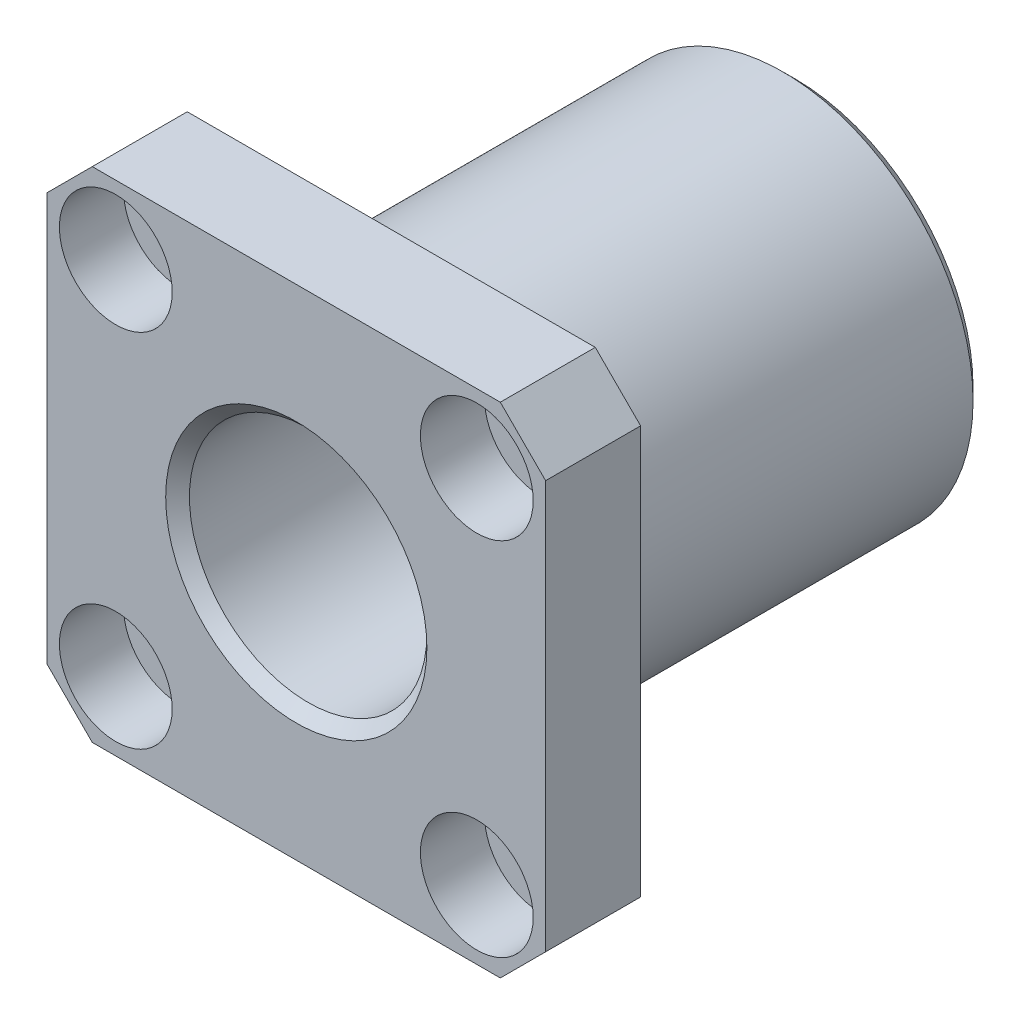
ISO-10303-21;
HEADER;
FILE_DESCRIPTION(('STEP AP214'),'2;1');
FILE_NAME('part.step','',(''),(''),'','','');
FILE_SCHEMA(('AUTOMOTIVE_DESIGN { 1 0 10303 214 1 1 1 1 }'));
ENDSEC;
DATA;
#1=APPLICATION_CONTEXT('core data for automotive mechanical design processes');
#2=APPLICATION_PROTOCOL_DEFINITION('international standard','automotive_design',2000,#1);
#3=PRODUCT_CONTEXT('',#1,'mechanical');
#4=PRODUCT('Part','Part','',(#3));
#5=PRODUCT_RELATED_PRODUCT_CATEGORY('part','',(#4));
#6=PRODUCT_DEFINITION_FORMATION('','',#4);
#7=PRODUCT_DEFINITION_CONTEXT('part definition',#1,'design');
#8=PRODUCT_DEFINITION('design','',#6,#7);
#9=PRODUCT_DEFINITION_SHAPE('','',#8);
#10=(LENGTH_UNIT() NAMED_UNIT(*) SI_UNIT(.MILLI.,.METRE.));
#11=(NAMED_UNIT(*) PLANE_ANGLE_UNIT() SI_UNIT($,.RADIAN.));
#12=(NAMED_UNIT(*) SI_UNIT($,.STERADIAN.) SOLID_ANGLE_UNIT());
#13=UNCERTAINTY_MEASURE_WITH_UNIT(LENGTH_MEASURE(1.E-05),#10,'distance_accuracy_value','');
#14=(GEOMETRIC_REPRESENTATION_CONTEXT(3) GLOBAL_UNCERTAINTY_ASSIGNED_CONTEXT((#13)) GLOBAL_UNIT_ASSIGNED_CONTEXT((#10,
#11,#12)) REPRESENTATION_CONTEXT('',''));
#15=CARTESIAN_POINT('',(0.,0.,0.));
#16=DIRECTION('',(0.,0.,1.));
#17=DIRECTION('',(1.,0.,0.));
#18=AXIS2_PLACEMENT_3D('',#15,#16,#17);
#19=CARTESIAN_POINT('',(0.,0.,42.));
#20=DIRECTION('',(0.,0.,-1.));
#21=DIRECTION('',(-1.,0.,0.));
#22=AXIS2_PLACEMENT_3D('',#19,#20,#21);
#23=CYLINDRICAL_SURFACE('',#22,16.);
#24=CARTESIAN_POINT('',(0.,0.,1.00000000000006));
#25=DIRECTION('',(0.,0.,1.));
#26=DIRECTION('',(1.,0.,0.));
#27=AXIS2_PLACEMENT_3D('',#24,#25,#26);
#28=CIRCLE('',#27,16.);
#29=CARTESIAN_POINT('',(-16.,0.,1.00000000000006));
#30=VERTEX_POINT('',#29);
#31=EDGE_CURVE('E141',#30,#30,#28,.T.);
#32=CARTESIAN_POINT('',(0.,0.,34.));
#33=DIRECTION('',(0.,0.,-1.));
#34=DIRECTION('',(-1.,0.,0.));
#35=AXIS2_PLACEMENT_3D('',#32,#33,#34);
#36=CIRCLE('',#35,16.);
#37=CARTESIAN_POINT('',(-16.,0.,34.));
#38=VERTEX_POINT('',#37);
#39=EDGE_CURVE('E138',#38,#38,#36,.T.);
#40=CARTESIAN_POINT('',(-16.,0.,1.00000000000006));
#41=CARTESIAN_POINT('',(-16.,0.,1.34375000000006));
#42=CARTESIAN_POINT('',(-16.,0.,1.68750000000005));
#43=CARTESIAN_POINT('',(-16.,0.,2.37500000000005));
#44=CARTESIAN_POINT('',(-16.,0.,2.71875000000005));
#45=CARTESIAN_POINT('',(-16.,0.,3.40625000000005));
#46=CARTESIAN_POINT('',(-16.,0.,3.75000000000005));
#47=CARTESIAN_POINT('',(-16.,0.,4.43750000000006));
#48=CARTESIAN_POINT('',(-16.,0.,4.78125000000005));
#49=CARTESIAN_POINT('',(-16.,0.,5.46875000000005));
#50=CARTESIAN_POINT('',(-16.,0.,5.81250000000005));
#51=CARTESIAN_POINT('',(-16.,0.,6.50000000000005));
#52=CARTESIAN_POINT('',(-16.,0.,6.84375000000005));
#53=CARTESIAN_POINT('',(-16.,0.,7.53125000000005));
#54=CARTESIAN_POINT('',(-16.,0.,7.87500000000005));
#55=CARTESIAN_POINT('',(-16.,0.,8.56250000000005));
#56=CARTESIAN_POINT('',(-16.,0.,8.90625000000005));
#57=CARTESIAN_POINT('',(-16.,0.,9.59375000000005));
#58=CARTESIAN_POINT('',(-16.,0.,9.93750000000005));
#59=CARTESIAN_POINT('',(-16.,0.,10.625));
#60=CARTESIAN_POINT('',(-16.,0.,10.96875));
#61=CARTESIAN_POINT('',(-16.,0.,11.65625));
#62=CARTESIAN_POINT('',(-16.,0.,12.));
#63=CARTESIAN_POINT('',(-16.,0.,12.6875));
#64=CARTESIAN_POINT('',(-16.,0.,13.03125));
#65=CARTESIAN_POINT('',(-16.,0.,13.71875));
#66=CARTESIAN_POINT('',(-16.,0.,14.0625));
#67=CARTESIAN_POINT('',(-16.,0.,14.75));
#68=CARTESIAN_POINT('',(-16.,0.,15.09375));
#69=CARTESIAN_POINT('',(-16.,0.,15.78125));
#70=CARTESIAN_POINT('',(-16.,0.,16.125));
#71=CARTESIAN_POINT('',(-16.,0.,16.8125));
#72=CARTESIAN_POINT('',(-16.,0.,17.15625));
#73=CARTESIAN_POINT('',(-16.,0.,17.84375));
#74=CARTESIAN_POINT('',(-16.,0.,18.1875));
#75=CARTESIAN_POINT('',(-16.,0.,18.875));
#76=CARTESIAN_POINT('',(-16.,0.,19.21875));
#77=CARTESIAN_POINT('',(-16.,0.,19.90625));
#78=CARTESIAN_POINT('',(-16.,0.,20.25));
#79=CARTESIAN_POINT('',(-16.,0.,20.9375));
#80=CARTESIAN_POINT('',(-16.,0.,21.28125));
#81=CARTESIAN_POINT('',(-16.,0.,21.96875));
#82=CARTESIAN_POINT('',(-16.,0.,22.3125));
#83=CARTESIAN_POINT('',(-16.,0.,23.));
#84=CARTESIAN_POINT('',(-16.,0.,23.34375));
#85=CARTESIAN_POINT('',(-16.,0.,24.03125));
#86=CARTESIAN_POINT('',(-16.,0.,24.375));
#87=CARTESIAN_POINT('',(-16.,0.,25.0625));
#88=CARTESIAN_POINT('',(-16.,0.,25.40625));
#89=CARTESIAN_POINT('',(-16.,0.,26.09375));
#90=CARTESIAN_POINT('',(-16.,0.,26.4375));
#91=CARTESIAN_POINT('',(-16.,0.,27.125));
#92=CARTESIAN_POINT('',(-16.,0.,27.46875));
#93=CARTESIAN_POINT('',(-16.,0.,28.15625));
#94=CARTESIAN_POINT('',(-16.,0.,28.5));
#95=CARTESIAN_POINT('',(-16.,0.,29.1875));
#96=CARTESIAN_POINT('',(-16.,0.,29.53125));
#97=CARTESIAN_POINT('',(-16.,0.,30.21875));
#98=CARTESIAN_POINT('',(-16.,0.,30.5625));
#99=CARTESIAN_POINT('',(-16.,0.,31.25));
#100=CARTESIAN_POINT('',(-16.,0.,31.59375));
#101=CARTESIAN_POINT('',(-16.,0.,32.28125));
#102=CARTESIAN_POINT('',(-16.,0.,32.625));
#103=CARTESIAN_POINT('',(-16.,0.,33.3125));
#104=CARTESIAN_POINT('',(-16.,0.,33.65625));
#105=CARTESIAN_POINT('',(-16.,0.,34.));
#106=B_SPLINE_CURVE_WITH_KNOTS('',3,(#40,#41,#42,#43,#44,#45,#46,#47,#48,#49,#50,#51,#52,#53,
#54,#55,#56,#57,#58,#59,#60,#61,#62,#63,#64,#65,#66,#67,#68,#69,#70,#71,#72,#73,#74,#75,#76,#77,
#78,#79,#80,#81,#82,#83,#84,#85,#86,#87,#88,#89,#90,#91,#92,#93,#94,#95,#96,#97,#98,#99,#100,
#101,#102,#103,#104,#105),.UNSPECIFIED.,.F.,.F.,(4,2,2,2,2,2,2,2,2,2,2,2,2,2,2,2,2,2,2,2,2,2,2,
2,2,2,2,2,2,2,2,2,4),(0.,1.03125,2.06249999999999,3.09375,4.125,5.15624999999999,
6.18749999999999,7.21874999999999,8.24999999999999,9.28124999999999,10.3125,11.34375,12.375,
13.40625,14.4375,15.46875,16.5,17.53125,18.5625,19.59375,20.625,21.65625,22.6875,23.71875,24.75,
25.78125,26.8125,27.84375,28.875,29.90625,30.9375,31.96875,33.),.UNSPECIFIED.);
#107=EDGE_CURVE('BSEAM33',#30,#38,#106,.T.);
#108=ORIENTED_EDGE('',*,*,#31,.T.);
#109=ORIENTED_EDGE('',*,*,#39,.T.);
#110=ORIENTED_EDGE('',*,*,#107,.T.);
#111=ORIENTED_EDGE('',*,*,#107,.F.);
#112=EDGE_LOOP('',(#108,#110,#109,#111));
#113=FACE_BOUND('',#112,.T.);
#114=ADVANCED_FACE('F33',(#113),#23,.T.);
#115=CARTESIAN_POINT('',(0.,0.,0.));
#116=DIRECTION('',(0.,0.,1.));
#117=DIRECTION('',(1.,0.,0.));
#118=AXIS2_PLACEMENT_3D('',#115,#116,#117);
#119=PLANE('',#118);
#120=CARTESIAN_POINT('',(0.,0.,0.));
#121=DIRECTION('',(0.,0.,1.));
#122=DIRECTION('',(1.,0.,0.));
#123=AXIS2_PLACEMENT_3D('',#120,#121,#122);
#124=CIRCLE('',#123,14.9999999999999);
#125=CARTESIAN_POINT('',(14.9999999999999,0.,0.));
#126=VERTEX_POINT('',#125);
#127=EDGE_CURVE('E164',#126,#126,#124,.F.);
#128=ORIENTED_EDGE('',*,*,#127,.T.);
#129=EDGE_LOOP('',(#128));
#130=FACE_BOUND('',#129,.T.);
#131=CARTESIAN_POINT('',(0.,0.,0.));
#132=DIRECTION('',(0.,0.,1.));
#133=DIRECTION('',(1.,0.,0.));
#134=AXIS2_PLACEMENT_3D('',#131,#132,#133);
#135=CIRCLE('',#134,10.);
#136=CARTESIAN_POINT('',(10.,0.,0.));
#137=VERTEX_POINT('',#136);
#138=EDGE_CURVE('E442',#137,#137,#135,.T.);
#139=ORIENTED_EDGE('',*,*,#138,.T.);
#140=EDGE_LOOP('',(#139));
#141=FACE_BOUND('',#140,.T.);
#142=ADVANCED_FACE('F181',(#130,#141),#119,.F.);
#143=CARTESIAN_POINT('',(21.,-21.,34.));
#144=DIRECTION('',(1.,0.,0.));
#145=DIRECTION('',(0.,0.,-1.));
#146=AXIS2_PLACEMENT_3D('',#143,#144,#145);
#147=PLANE('',#146);
#148=DIRECTION('',(0.,0.,1.));
#149=VECTOR('',#148,1.);
#150=CARTESIAN_POINT('',(21.,-17.1837661840736,0.));
#151=LINE('',#150,#149);
#152=CARTESIAN_POINT('',(21.,-17.1837661840736,34.));
#153=VERTEX_POINT('',#152);
#154=CARTESIAN_POINT('',(21.,-17.1837661840736,42.));
#155=VERTEX_POINT('',#154);
#156=EDGE_CURVE('E474',#153,#155,#151,.T.);
#157=ORIENTED_EDGE('',*,*,#156,.F.);
#158=DIRECTION('',(0.,1.,0.));
#159=VECTOR('',#158,1.);
#160=CARTESIAN_POINT('',(21.,-21.,34.));
#161=LINE('',#160,#159);
#162=CARTESIAN_POINT('',(21.,17.1837661840736,34.));
#163=VERTEX_POINT('',#162);
#164=EDGE_CURVE('E117',#153,#163,#161,.T.);
#165=ORIENTED_EDGE('',*,*,#164,.T.);
#166=DIRECTION('',(0.,0.,1.));
#167=VECTOR('',#166,1.);
#168=CARTESIAN_POINT('',(21.,17.1837661840736,0.));
#169=LINE('',#168,#167);
#170=CARTESIAN_POINT('',(21.,17.1837661840736,42.));
#171=VERTEX_POINT('',#170);
#172=EDGE_CURVE('E100',#163,#171,#169,.T.);
#173=ORIENTED_EDGE('',*,*,#172,.T.);
#174=DIRECTION('',(0.,1.,0.));
#175=VECTOR('',#174,1.);
#176=CARTESIAN_POINT('',(21.,-21.,42.));
#177=LINE('',#176,#175);
#178=EDGE_CURVE('E115',#155,#171,#177,.T.);
#179=ORIENTED_EDGE('',*,*,#178,.F.);
#180=EDGE_LOOP('',(#157,#165,#173,#179));
#181=FACE_BOUND('',#180,.T.);
#182=ADVANCED_FACE('F114',(#181),#147,.T.);
#183=CARTESIAN_POINT('',(-21.,-21.,34.));
#184=DIRECTION('',(0.,-1.,0.));
#185=DIRECTION('',(0.,0.,-1.));
#186=AXIS2_PLACEMENT_3D('',#183,#184,#185);
#187=PLANE('',#186);
#188=DIRECTION('',(0.,0.,1.));
#189=VECTOR('',#188,1.);
#190=CARTESIAN_POINT('',(-17.1837661840736,-21.,0.));
#191=LINE('',#190,#189);
#192=CARTESIAN_POINT('',(-17.1837661840736,-21.,34.));
#193=VERTEX_POINT('',#192);
#194=CARTESIAN_POINT('',(-17.1837661840736,-21.,42.));
#195=VERTEX_POINT('',#194);
#196=EDGE_CURVE('E48',#193,#195,#191,.T.);
#197=ORIENTED_EDGE('',*,*,#196,.F.);
#198=DIRECTION('',(1.,0.,0.));
#199=VECTOR('',#198,1.);
#200=CARTESIAN_POINT('',(-21.,-21.,34.));
#201=LINE('',#200,#199);
#202=CARTESIAN_POINT('',(17.1837661840736,-21.,34.));
#203=VERTEX_POINT('',#202);
#204=EDGE_CURVE('E131',#193,#203,#201,.T.);
#205=ORIENTED_EDGE('',*,*,#204,.T.);
#206=DIRECTION('',(0.,0.,1.));
#207=VECTOR('',#206,1.);
#208=CARTESIAN_POINT('',(17.1837661840736,-21.,0.));
#209=LINE('',#208,#207);
#210=CARTESIAN_POINT('',(17.1837661840736,-21.,42.));
#211=VERTEX_POINT('',#210);
#212=EDGE_CURVE('E108',#203,#211,#209,.T.);
#213=ORIENTED_EDGE('',*,*,#212,.T.);
#214=DIRECTION('',(1.,0.,0.));
#215=VECTOR('',#214,1.);
#216=CARTESIAN_POINT('',(-21.,-21.,42.));
#217=LINE('',#216,#215);
#218=EDGE_CURVE('E136',#195,#211,#217,.T.);
#219=ORIENTED_EDGE('',*,*,#218,.F.);
#220=EDGE_LOOP('',(#197,#205,#213,#219));
#221=FACE_BOUND('',#220,.T.);
#222=ADVANCED_FACE('F198',(#221),#187,.T.);
#223=CARTESIAN_POINT('',(-21.,-21.,34.));
#224=DIRECTION('',(-1.,0.,0.));
#225=DIRECTION('',(0.,0.,1.));
#226=AXIS2_PLACEMENT_3D('',#223,#224,#225);
#227=PLANE('',#226);
#228=DIRECTION('',(0.,0.,1.));
#229=VECTOR('',#228,1.);
#230=CARTESIAN_POINT('',(-21.,-17.1837661840736,0.));
#231=LINE('',#230,#229);
#232=CARTESIAN_POINT('',(-21.,-17.1837661840736,34.));
#233=VERTEX_POINT('',#232);
#234=CARTESIAN_POINT('',(-21.,-17.1837661840736,42.));
#235=VERTEX_POINT('',#234);
#236=EDGE_CURVE('E479',#233,#235,#231,.T.);
#237=ORIENTED_EDGE('',*,*,#236,.T.);
#238=DIRECTION('',(0.,-1.,0.));
#239=VECTOR('',#238,1.);
#240=CARTESIAN_POINT('',(-21.,-21.,42.));
#241=LINE('',#240,#239);
#242=CARTESIAN_POINT('',(-21.,17.1837661840736,42.));
#243=VERTEX_POINT('',#242);
#244=EDGE_CURVE('E126',#243,#235,#241,.T.);
#245=ORIENTED_EDGE('',*,*,#244,.F.);
#246=DIRECTION('',(0.,0.,1.));
#247=VECTOR('',#246,1.);
#248=CARTESIAN_POINT('',(-21.,17.1837661840736,0.));
#249=LINE('',#248,#247);
#250=CARTESIAN_POINT('',(-21.,17.1837661840736,34.));
#251=VERTEX_POINT('',#250);
#252=EDGE_CURVE('E56',#251,#243,#249,.T.);
#253=ORIENTED_EDGE('',*,*,#252,.F.);
#254=DIRECTION('',(0.,-1.,0.));
#255=VECTOR('',#254,1.);
#256=CARTESIAN_POINT('',(-21.,-21.,34.));
#257=LINE('',#256,#255);
#258=EDGE_CURVE('E496',#251,#233,#257,.T.);
#259=ORIENTED_EDGE('',*,*,#258,.T.);
#260=EDGE_LOOP('',(#237,#245,#253,#259));
#261=FACE_BOUND('',#260,.T.);
#262=ADVANCED_FACE('F202',(#261),#227,.T.);
#263=CARTESIAN_POINT('',(-21.,21.,34.));
#264=DIRECTION('',(0.,1.,0.));
#265=DIRECTION('',(0.,0.,1.));
#266=AXIS2_PLACEMENT_3D('',#263,#264,#265);
#267=PLANE('',#266);
#268=DIRECTION('',(0.,0.,1.));
#269=VECTOR('',#268,1.);
#270=CARTESIAN_POINT('',(17.1837661840736,21.,0.));
#271=LINE('',#270,#269);
#272=CARTESIAN_POINT('',(17.1837661840736,21.,34.));
#273=VERTEX_POINT('',#272);
#274=CARTESIAN_POINT('',(17.1837661840736,21.,42.));
#275=VERTEX_POINT('',#274);
#276=EDGE_CURVE('E103',#273,#275,#271,.T.);
#277=ORIENTED_EDGE('',*,*,#276,.F.);
#278=DIRECTION('',(-1.,0.,0.));
#279=VECTOR('',#278,1.);
#280=CARTESIAN_POINT('',(-21.,21.,34.));
#281=LINE('',#280,#279);
#282=CARTESIAN_POINT('',(-17.1837661840736,21.,34.));
#283=VERTEX_POINT('',#282);
#284=EDGE_CURVE('E494',#273,#283,#281,.T.);
#285=ORIENTED_EDGE('',*,*,#284,.T.);
#286=DIRECTION('',(0.,0.,1.));
#287=VECTOR('',#286,1.);
#288=CARTESIAN_POINT('',(-17.1837661840736,21.,0.));
#289=LINE('',#288,#287);
#290=CARTESIAN_POINT('',(-17.1837661840736,21.,42.));
#291=VERTEX_POINT('',#290);
#292=EDGE_CURVE('E484',#283,#291,#289,.T.);
#293=ORIENTED_EDGE('',*,*,#292,.T.);
#294=DIRECTION('',(-1.,0.,0.));
#295=VECTOR('',#294,1.);
#296=CARTESIAN_POINT('',(-21.,21.,42.));
#297=LINE('',#296,#295);
#298=EDGE_CURVE('E123',#275,#291,#297,.T.);
#299=ORIENTED_EDGE('',*,*,#298,.F.);
#300=EDGE_LOOP('',(#277,#285,#293,#299));
#301=FACE_BOUND('',#300,.T.);
#302=ADVANCED_FACE('F199',(#301),#267,.T.);
#303=CARTESIAN_POINT('',(0.,0.,34.));
#304=DIRECTION('',(0.,0.,-1.));
#305=DIRECTION('',(-1.,0.,0.));
#306=AXIS2_PLACEMENT_3D('',#303,#304,#305);
#307=PLANE('',#306);
#308=CARTESIAN_POINT('',(-15.2027957955108,15.2027957955108,34.));
#309=DIRECTION('',(0.,0.,-1.));
#310=DIRECTION('',(-1.,0.,0.));
#311=AXIS2_PLACEMENT_3D('',#308,#309,#310);
#312=CIRCLE('',#311,2.75);
#313=CARTESIAN_POINT('',(-17.9527957955108,15.2027957955108,34.));
#314=VERTEX_POINT('',#313);
#315=EDGE_CURVE('E157',#314,#314,#312,.T.);
#316=ORIENTED_EDGE('',*,*,#315,.F.);
#317=EDGE_LOOP('',(#316));
#318=FACE_BOUND('',#317,.T.);
#319=CARTESIAN_POINT('',(15.2027957955108,15.2027957955108,34.));
#320=DIRECTION('',(0.,0.,-1.));
#321=DIRECTION('',(-1.,0.,0.));
#322=AXIS2_PLACEMENT_3D('',#319,#320,#321);
#323=CIRCLE('',#322,2.75);
#324=CARTESIAN_POINT('',(12.4527957955108,15.2027957955108,34.));
#325=VERTEX_POINT('',#324);
#326=EDGE_CURVE('E152',#325,#325,#323,.T.);
#327=ORIENTED_EDGE('',*,*,#326,.F.);
#328=EDGE_LOOP('',(#327));
#329=FACE_BOUND('',#328,.T.);
#330=CARTESIAN_POINT('',(15.2027957955108,-15.2027957955108,34.));
#331=DIRECTION('',(0.,0.,-1.));
#332=DIRECTION('',(-1.,0.,0.));
#333=AXIS2_PLACEMENT_3D('',#330,#331,#332);
#334=CIRCLE('',#333,2.75);
#335=CARTESIAN_POINT('',(12.4527957955108,-15.2027957955108,34.));
#336=VERTEX_POINT('',#335);
#337=EDGE_CURVE('E147',#336,#336,#334,.T.);
#338=ORIENTED_EDGE('',*,*,#337,.F.);
#339=EDGE_LOOP('',(#338));
#340=FACE_BOUND('',#339,.T.);
#341=CARTESIAN_POINT('',(-15.2027957955108,-15.2027957955108,34.));
#342=DIRECTION('',(0.,0.,-1.));
#343=DIRECTION('',(-1.,0.,0.));
#344=AXIS2_PLACEMENT_3D('',#341,#342,#343);
#345=CIRCLE('',#344,2.75);
#346=CARTESIAN_POINT('',(-17.9527957955108,-15.2027957955108,34.));
#347=VERTEX_POINT('',#346);
#348=EDGE_CURVE('E142',#347,#347,#345,.T.);
#349=ORIENTED_EDGE('',*,*,#348,.F.);
#350=EDGE_LOOP('',(#349));
#351=FACE_BOUND('',#350,.T.);
#352=DIRECTION('',(0.707106781186548,-0.707106781186548,0.));
#353=VECTOR('',#352,1.);
#354=CARTESIAN_POINT('',(-19.0918830920368,-19.0918830920368,34.));
#355=LINE('',#354,#353);
#356=EDGE_CURVE('E124',#233,#193,#355,.T.);
#357=ORIENTED_EDGE('',*,*,#356,.F.);
#358=ORIENTED_EDGE('',*,*,#258,.F.);
#359=DIRECTION('',(-0.707106781186548,-0.707106781186548,0.));
#360=VECTOR('',#359,1.);
#361=CARTESIAN_POINT('',(-19.0918830920368,19.0918830920368,34.));
#362=LINE('',#361,#360);
#363=EDGE_CURVE('E487',#283,#251,#362,.T.);
#364=ORIENTED_EDGE('',*,*,#363,.F.);
#365=ORIENTED_EDGE('',*,*,#284,.F.);
#366=DIRECTION('',(-0.707106781186548,0.707106781186548,0.));
#367=VECTOR('',#366,1.);
#368=CARTESIAN_POINT('',(19.0918830920368,19.0918830920368,34.));
#369=LINE('',#368,#367);
#370=EDGE_CURVE('E490',#163,#273,#369,.T.);
#371=ORIENTED_EDGE('',*,*,#370,.F.);
#372=ORIENTED_EDGE('',*,*,#164,.F.);
#373=DIRECTION('',(0.707106781186548,0.707106781186548,0.));
#374=VECTOR('',#373,1.);
#375=CARTESIAN_POINT('',(19.0918830920368,-19.0918830920368,34.));
#376=LINE('',#375,#374);
#377=EDGE_CURVE('E128',#203,#153,#376,.T.);
#378=ORIENTED_EDGE('',*,*,#377,.F.);
#379=ORIENTED_EDGE('',*,*,#204,.F.);
#380=EDGE_LOOP('',(#357,#358,#364,#365,#371,#372,#378,#379));
#381=FACE_BOUND('',#380,.T.);
#382=ORIENTED_EDGE('',*,*,#39,.F.);
#383=EDGE_LOOP('',(#382));
#384=FACE_BOUND('',#383,.T.);
#385=ADVANCED_FACE('F194',(#318,#329,#340,#351,#381,#384),#307,.T.);
#386=CARTESIAN_POINT('',(0.,0.,42.));
#387=DIRECTION('',(0.,0.,1.));
#388=DIRECTION('',(1.,0.,0.));
#389=AXIS2_PLACEMENT_3D('',#386,#387,#388);
#390=PLANE('',#389);
#391=CARTESIAN_POINT('',(0.,0.,42.));
#392=DIRECTION('',(0.,0.,1.));
#393=DIRECTION('',(1.,0.,0.));
#394=AXIS2_PLACEMENT_3D('',#391,#392,#393);
#395=CIRCLE('',#394,11.0000000000001);
#396=CARTESIAN_POINT('',(11.0000000000001,0.,42.));
#397=VERTEX_POINT('',#396);
#398=EDGE_CURVE('E11',#397,#397,#395,.F.);
#399=ORIENTED_EDGE('',*,*,#398,.T.);
#400=EDGE_LOOP('',(#399));
#401=FACE_BOUND('',#400,.T.);
#402=CARTESIAN_POINT('',(-15.2027957955108,15.2027957955108,42.));
#403=DIRECTION('',(0.,0.,1.));
#404=DIRECTION('',(1.,0.,0.));
#405=AXIS2_PLACEMENT_3D('',#402,#403,#404);
#406=CIRCLE('',#405,4.75);
#407=CARTESIAN_POINT('',(-10.4527957955108,15.2027957955108,42.));
#408=VERTEX_POINT('',#407);
#409=EDGE_CURVE('E440',#408,#408,#406,.T.);
#410=ORIENTED_EDGE('',*,*,#409,.F.);
#411=EDGE_LOOP('',(#410));
#412=FACE_BOUND('',#411,.T.);
#413=CARTESIAN_POINT('',(15.2027957955108,15.2027957955108,42.));
#414=DIRECTION('',(0.,0.,1.));
#415=DIRECTION('',(1.,0.,0.));
#416=AXIS2_PLACEMENT_3D('',#413,#414,#415);
#417=CIRCLE('',#416,4.75);
#418=CARTESIAN_POINT('',(19.9527957955108,15.2027957955108,42.));
#419=VERTEX_POINT('',#418);
#420=EDGE_CURVE('E160',#419,#419,#417,.T.);
#421=ORIENTED_EDGE('',*,*,#420,.F.);
#422=EDGE_LOOP('',(#421));
#423=FACE_BOUND('',#422,.T.);
#424=CARTESIAN_POINT('',(15.2027957955108,-15.2027957955108,42.));
#425=DIRECTION('',(0.,0.,1.));
#426=DIRECTION('',(1.,0.,0.));
#427=AXIS2_PLACEMENT_3D('',#424,#425,#426);
#428=CIRCLE('',#427,4.75);
#429=CARTESIAN_POINT('',(19.9527957955108,-15.2027957955108,42.));
#430=VERTEX_POINT('',#429);
#431=EDGE_CURVE('E155',#430,#430,#428,.T.);
#432=ORIENTED_EDGE('',*,*,#431,.F.);
#433=EDGE_LOOP('',(#432));
#434=FACE_BOUND('',#433,.T.);
#435=CARTESIAN_POINT('',(-15.2027957955108,-15.2027957955108,42.));
#436=DIRECTION('',(0.,0.,1.));
#437=DIRECTION('',(1.,0.,0.));
#438=AXIS2_PLACEMENT_3D('',#435,#436,#437);
#439=CIRCLE('',#438,4.75);
#440=CARTESIAN_POINT('',(-10.4527957955108,-15.2027957955108,42.));
#441=VERTEX_POINT('',#440);
#442=EDGE_CURVE('E150',#441,#441,#439,.T.);
#443=ORIENTED_EDGE('',*,*,#442,.F.);
#444=EDGE_LOOP('',(#443));
#445=FACE_BOUND('',#444,.T.);
#446=DIRECTION('',(-0.707106781186548,0.707106781186548,0.));
#447=VECTOR('',#446,1.);
#448=CARTESIAN_POINT('',(-21.,-17.1837661840736,42.));
#449=LINE('',#448,#447);
#450=EDGE_CURVE('E145',#195,#235,#449,.T.);
#451=ORIENTED_EDGE('',*,*,#450,.F.);
#452=ORIENTED_EDGE('',*,*,#218,.T.);
#453=DIRECTION('',(-0.707106781186548,-0.707106781186548,0.));
#454=VECTOR('',#453,1.);
#455=CARTESIAN_POINT('',(21.,-17.1837661840736,42.));
#456=LINE('',#455,#454);
#457=EDGE_CURVE('E122',#155,#211,#456,.T.);
#458=ORIENTED_EDGE('',*,*,#457,.F.);
#459=ORIENTED_EDGE('',*,*,#178,.T.);
#460=DIRECTION('',(0.707106781186548,-0.707106781186548,0.));
#461=VECTOR('',#460,1.);
#462=CARTESIAN_POINT('',(21.,17.1837661840736,42.));
#463=LINE('',#462,#461);
#464=EDGE_CURVE('E97',#275,#171,#463,.T.);
#465=ORIENTED_EDGE('',*,*,#464,.F.);
#466=ORIENTED_EDGE('',*,*,#298,.T.);
#467=DIRECTION('',(0.707106781186548,0.707106781186548,0.));
#468=VECTOR('',#467,1.);
#469=CARTESIAN_POINT('',(-21.,17.1837661840736,42.));
#470=LINE('',#469,#468);
#471=EDGE_CURVE('E471',#243,#291,#470,.T.);
#472=ORIENTED_EDGE('',*,*,#471,.F.);
#473=ORIENTED_EDGE('',*,*,#244,.T.);
#474=EDGE_LOOP('',(#451,#452,#458,#459,#465,#466,#472,#473));
#475=FACE_BOUND('',#474,.T.);
#476=ADVANCED_FACE('F120',(#401,#412,#423,#434,#445,#475),#390,.T.);
#477=CARTESIAN_POINT('',(-21.,17.1837661840736,0.));
#478=DIRECTION('',(0.707106781186547,-0.707106781186547,0.));
#479=DIRECTION('',(0.707106781186548,0.707106781186548,0.));
#480=AXIS2_PLACEMENT_3D('',#477,#478,#479);
#481=PLANE('',#480);
#482=ORIENTED_EDGE('',*,*,#363,.T.);
#483=ORIENTED_EDGE('',*,*,#252,.T.);
#484=ORIENTED_EDGE('',*,*,#471,.T.);
#485=ORIENTED_EDGE('',*,*,#292,.F.);
#486=EDGE_LOOP('',(#482,#483,#484,#485));
#487=FACE_BOUND('',#486,.T.);
#488=ADVANCED_FACE('F193',(#487),#481,.F.);
#489=CARTESIAN_POINT('',(21.,17.1837661840736,0.));
#490=DIRECTION('',(-0.707106781186547,-0.707106781186547,0.));
#491=DIRECTION('',(0.707106781186548,-0.707106781186548,0.));
#492=AXIS2_PLACEMENT_3D('',#489,#490,#491);
#493=PLANE('',#492);
#494=ORIENTED_EDGE('',*,*,#370,.T.);
#495=ORIENTED_EDGE('',*,*,#276,.T.);
#496=ORIENTED_EDGE('',*,*,#464,.T.);
#497=ORIENTED_EDGE('',*,*,#172,.F.);
#498=EDGE_LOOP('',(#494,#495,#496,#497));
#499=FACE_BOUND('',#498,.T.);
#500=ADVANCED_FACE('F99',(#499),#493,.F.);
#501=CARTESIAN_POINT('',(21.,-17.1837661840736,0.));
#502=DIRECTION('',(-0.707106781186547,0.707106781186547,0.));
#503=DIRECTION('',(-0.707106781186548,-0.707106781186548,0.));
#504=AXIS2_PLACEMENT_3D('',#501,#502,#503);
#505=PLANE('',#504);
#506=ORIENTED_EDGE('',*,*,#377,.T.);
#507=ORIENTED_EDGE('',*,*,#156,.T.);
#508=ORIENTED_EDGE('',*,*,#457,.T.);
#509=ORIENTED_EDGE('',*,*,#212,.F.);
#510=EDGE_LOOP('',(#506,#507,#508,#509));
#511=FACE_BOUND('',#510,.T.);
#512=ADVANCED_FACE('F219',(#511),#505,.F.);
#513=CARTESIAN_POINT('',(-21.,-17.1837661840736,0.));
#514=DIRECTION('',(0.707106781186547,0.707106781186547,0.));
#515=DIRECTION('',(-0.707106781186548,0.707106781186548,0.));
#516=AXIS2_PLACEMENT_3D('',#513,#514,#515);
#517=PLANE('',#516);
#518=ORIENTED_EDGE('',*,*,#356,.T.);
#519=ORIENTED_EDGE('',*,*,#196,.T.);
#520=ORIENTED_EDGE('',*,*,#450,.T.);
#521=ORIENTED_EDGE('',*,*,#236,.F.);
#522=EDGE_LOOP('',(#518,#519,#520,#521));
#523=FACE_BOUND('',#522,.T.);
#524=ADVANCED_FACE('F215',(#523),#517,.F.);
#525=CARTESIAN_POINT('',(-15.2027957955108,-15.2027957955108,42.));
#526=DIRECTION('',(0.,0.,1.));
#527=DIRECTION('',(1.,0.,0.));
#528=AXIS2_PLACEMENT_3D('',#525,#526,#527);
#529=CYLINDRICAL_SURFACE('',#528,2.75);
#530=ORIENTED_EDGE('',*,*,#348,.T.);
#531=EDGE_LOOP('',(#530));
#532=FACE_BOUND('',#531,.T.);
#533=CARTESIAN_POINT('',(-15.2027957955108,-15.2027957955108,36.6));
#534=DIRECTION('',(0.,0.,1.));
#535=DIRECTION('',(1.,0.,0.));
#536=AXIS2_PLACEMENT_3D('',#533,#534,#535);
#537=CIRCLE('',#536,2.75);
#538=CARTESIAN_POINT('',(-12.4527957955108,-15.2027957955108,36.6));
#539=VERTEX_POINT('',#538);
#540=EDGE_CURVE('E146',#539,#539,#537,.T.);
#541=ORIENTED_EDGE('',*,*,#540,.T.);
#542=EDGE_LOOP('',(#541));
#543=FACE_BOUND('',#542,.T.);
#544=ADVANCED_FACE('F218',(#532,#543),#529,.F.);
#545=CARTESIAN_POINT('',(-12.4527957955108,-15.2027957955108,36.6));
#546=DIRECTION('',(0.,0.,-1.));
#547=DIRECTION('',(-1.,0.,0.));
#548=AXIS2_PLACEMENT_3D('',#545,#546,#547);
#549=PLANE('',#548);
#550=ORIENTED_EDGE('',*,*,#540,.F.);
#551=EDGE_LOOP('',(#550));
#552=FACE_BOUND('',#551,.T.);
#553=CARTESIAN_POINT('',(-15.2027957955108,-15.2027957955108,36.6));
#554=DIRECTION('',(0.,0.,1.));
#555=DIRECTION('',(1.,0.,0.));
#556=AXIS2_PLACEMENT_3D('',#553,#554,#555);
#557=CIRCLE('',#556,4.75);
#558=CARTESIAN_POINT('',(-10.4527957955108,-15.2027957955108,36.6));
#559=VERTEX_POINT('',#558);
#560=EDGE_CURVE('E466',#559,#559,#557,.T.);
#561=ORIENTED_EDGE('',*,*,#560,.T.);
#562=EDGE_LOOP('',(#561));
#563=FACE_BOUND('',#562,.T.);
#564=ADVANCED_FACE('F227',(#552,#563),#549,.F.);
#565=CARTESIAN_POINT('',(-15.2027957955108,-15.2027957955108,42.));
#566=DIRECTION('',(0.,0.,1.));
#567=DIRECTION('',(1.,0.,0.));
#568=AXIS2_PLACEMENT_3D('',#565,#566,#567);
#569=CYLINDRICAL_SURFACE('',#568,4.75);
#570=ORIENTED_EDGE('',*,*,#560,.F.);
#571=EDGE_LOOP('',(#570));
#572=FACE_BOUND('',#571,.T.);
#573=ORIENTED_EDGE('',*,*,#442,.T.);
#574=EDGE_LOOP('',(#573));
#575=FACE_BOUND('',#574,.T.);
#576=ADVANCED_FACE('F231',(#572,#575),#569,.F.);
#577=CARTESIAN_POINT('',(15.2027957955108,-15.2027957955108,42.));
#578=DIRECTION('',(0.,0.,1.));
#579=DIRECTION('',(1.,0.,0.));
#580=AXIS2_PLACEMENT_3D('',#577,#578,#579);
#581=CYLINDRICAL_SURFACE('',#580,2.75);
#582=ORIENTED_EDGE('',*,*,#337,.T.);
#583=EDGE_LOOP('',(#582));
#584=FACE_BOUND('',#583,.T.);
#585=CARTESIAN_POINT('',(15.2027957955108,-15.2027957955108,36.6));
#586=DIRECTION('',(0.,0.,1.));
#587=DIRECTION('',(1.,0.,0.));
#588=AXIS2_PLACEMENT_3D('',#585,#586,#587);
#589=CIRCLE('',#588,2.75);
#590=CARTESIAN_POINT('',(17.9527957955108,-15.2027957955108,36.6));
#591=VERTEX_POINT('',#590);
#592=EDGE_CURVE('E151',#591,#591,#589,.T.);
#593=ORIENTED_EDGE('',*,*,#592,.T.);
#594=EDGE_LOOP('',(#593));
#595=FACE_BOUND('',#594,.T.);
#596=ADVANCED_FACE('F235',(#584,#595),#581,.F.);
#597=CARTESIAN_POINT('',(17.9527957955108,-15.2027957955108,36.6));
#598=DIRECTION('',(0.,0.,-1.));
#599=DIRECTION('',(-1.,0.,0.));
#600=AXIS2_PLACEMENT_3D('',#597,#598,#599);
#601=PLANE('',#600);
#602=ORIENTED_EDGE('',*,*,#592,.F.);
#603=EDGE_LOOP('',(#602));
#604=FACE_BOUND('',#603,.T.);
#605=CARTESIAN_POINT('',(15.2027957955108,-15.2027957955108,36.6));
#606=DIRECTION('',(0.,0.,1.));
#607=DIRECTION('',(1.,0.,0.));
#608=AXIS2_PLACEMENT_3D('',#605,#606,#607);
#609=CIRCLE('',#608,4.75);
#610=CARTESIAN_POINT('',(19.9527957955108,-15.2027957955108,36.6));
#611=VERTEX_POINT('',#610);
#612=EDGE_CURVE('E459',#611,#611,#609,.T.);
#613=ORIENTED_EDGE('',*,*,#612,.T.);
#614=EDGE_LOOP('',(#613));
#615=FACE_BOUND('',#614,.T.);
#616=ADVANCED_FACE('F239',(#604,#615),#601,.F.);
#617=CARTESIAN_POINT('',(15.2027957955108,-15.2027957955108,42.));
#618=DIRECTION('',(0.,0.,1.));
#619=DIRECTION('',(1.,0.,0.));
#620=AXIS2_PLACEMENT_3D('',#617,#618,#619);
#621=CYLINDRICAL_SURFACE('',#620,4.75);
#622=ORIENTED_EDGE('',*,*,#612,.F.);
#623=EDGE_LOOP('',(#622));
#624=FACE_BOUND('',#623,.T.);
#625=ORIENTED_EDGE('',*,*,#431,.T.);
#626=EDGE_LOOP('',(#625));
#627=FACE_BOUND('',#626,.T.);
#628=ADVANCED_FACE('F243',(#624,#627),#621,.F.);
#629=CARTESIAN_POINT('',(15.2027957955108,15.2027957955108,42.));
#630=DIRECTION('',(0.,0.,1.));
#631=DIRECTION('',(1.,0.,0.));
#632=AXIS2_PLACEMENT_3D('',#629,#630,#631);
#633=CYLINDRICAL_SURFACE('',#632,2.75);
#634=ORIENTED_EDGE('',*,*,#326,.T.);
#635=EDGE_LOOP('',(#634));
#636=FACE_BOUND('',#635,.T.);
#637=CARTESIAN_POINT('',(15.2027957955108,15.2027957955108,36.6));
#638=DIRECTION('',(0.,0.,1.));
#639=DIRECTION('',(1.,0.,0.));
#640=AXIS2_PLACEMENT_3D('',#637,#638,#639);
#641=CIRCLE('',#640,2.75);
#642=CARTESIAN_POINT('',(17.9527957955108,15.2027957955108,36.6));
#643=VERTEX_POINT('',#642);
#644=EDGE_CURVE('E156',#643,#643,#641,.T.);
#645=ORIENTED_EDGE('',*,*,#644,.T.);
#646=EDGE_LOOP('',(#645));
#647=FACE_BOUND('',#646,.T.);
#648=ADVANCED_FACE('F247',(#636,#647),#633,.F.);
#649=CARTESIAN_POINT('',(17.9527957955108,15.2027957955108,36.6));
#650=DIRECTION('',(0.,0.,-1.));
#651=DIRECTION('',(-1.,0.,0.));
#652=AXIS2_PLACEMENT_3D('',#649,#650,#651);
#653=PLANE('',#652);
#654=ORIENTED_EDGE('',*,*,#644,.F.);
#655=EDGE_LOOP('',(#654));
#656=FACE_BOUND('',#655,.T.);
#657=CARTESIAN_POINT('',(15.2027957955108,15.2027957955108,36.6));
#658=DIRECTION('',(0.,0.,1.));
#659=DIRECTION('',(1.,0.,0.));
#660=AXIS2_PLACEMENT_3D('',#657,#658,#659);
#661=CIRCLE('',#660,4.75);
#662=CARTESIAN_POINT('',(19.9527957955108,15.2027957955108,36.6));
#663=VERTEX_POINT('',#662);
#664=EDGE_CURVE('E452',#663,#663,#661,.T.);
#665=ORIENTED_EDGE('',*,*,#664,.T.);
#666=EDGE_LOOP('',(#665));
#667=FACE_BOUND('',#666,.T.);
#668=ADVANCED_FACE('F251',(#656,#667),#653,.F.);
#669=CARTESIAN_POINT('',(15.2027957955108,15.2027957955108,42.));
#670=DIRECTION('',(0.,0.,1.));
#671=DIRECTION('',(1.,0.,0.));
#672=AXIS2_PLACEMENT_3D('',#669,#670,#671);
#673=CYLINDRICAL_SURFACE('',#672,4.75);
#674=ORIENTED_EDGE('',*,*,#664,.F.);
#675=EDGE_LOOP('',(#674));
#676=FACE_BOUND('',#675,.T.);
#677=ORIENTED_EDGE('',*,*,#420,.T.);
#678=EDGE_LOOP('',(#677));
#679=FACE_BOUND('',#678,.T.);
#680=ADVANCED_FACE('F255',(#676,#679),#673,.F.);
#681=CARTESIAN_POINT('',(-15.2027957955108,15.2027957955108,42.));
#682=DIRECTION('',(0.,0.,1.));
#683=DIRECTION('',(1.,0.,0.));
#684=AXIS2_PLACEMENT_3D('',#681,#682,#683);
#685=CYLINDRICAL_SURFACE('',#684,2.75);
#686=ORIENTED_EDGE('',*,*,#315,.T.);
#687=EDGE_LOOP('',(#686));
#688=FACE_BOUND('',#687,.T.);
#689=CARTESIAN_POINT('',(-15.2027957955108,15.2027957955108,36.6));
#690=DIRECTION('',(0.,0.,1.));
#691=DIRECTION('',(1.,0.,0.));
#692=AXIS2_PLACEMENT_3D('',#689,#690,#691);
#693=CIRCLE('',#692,2.75);
#694=CARTESIAN_POINT('',(-12.4527957955108,15.2027957955108,36.6));
#695=VERTEX_POINT('',#694);
#696=EDGE_CURVE('E161',#695,#695,#693,.T.);
#697=ORIENTED_EDGE('',*,*,#696,.T.);
#698=EDGE_LOOP('',(#697));
#699=FACE_BOUND('',#698,.T.);
#700=ADVANCED_FACE('F259',(#688,#699),#685,.F.);
#701=CARTESIAN_POINT('',(-12.4527957955108,15.2027957955108,36.6));
#702=DIRECTION('',(0.,0.,-1.));
#703=DIRECTION('',(-1.,0.,0.));
#704=AXIS2_PLACEMENT_3D('',#701,#702,#703);
#705=PLANE('',#704);
#706=ORIENTED_EDGE('',*,*,#696,.F.);
#707=EDGE_LOOP('',(#706));
#708=FACE_BOUND('',#707,.T.);
#709=CARTESIAN_POINT('',(-15.2027957955108,15.2027957955108,36.6));
#710=DIRECTION('',(0.,0.,1.));
#711=DIRECTION('',(1.,0.,0.));
#712=AXIS2_PLACEMENT_3D('',#709,#710,#711);
#713=CIRCLE('',#712,4.75);
#714=CARTESIAN_POINT('',(-10.4527957955108,15.2027957955108,36.6));
#715=VERTEX_POINT('',#714);
#716=EDGE_CURVE('E437',#715,#715,#713,.T.);
#717=ORIENTED_EDGE('',*,*,#716,.T.);
#718=EDGE_LOOP('',(#717));
#719=FACE_BOUND('',#718,.T.);
#720=ADVANCED_FACE('F263',(#708,#719),#705,.F.);
#721=CARTESIAN_POINT('',(-15.2027957955108,15.2027957955108,42.));
#722=DIRECTION('',(0.,0.,1.));
#723=DIRECTION('',(1.,0.,0.));
#724=AXIS2_PLACEMENT_3D('',#721,#722,#723);
#725=CYLINDRICAL_SURFACE('',#724,4.75);
#726=ORIENTED_EDGE('',*,*,#716,.F.);
#727=EDGE_LOOP('',(#726));
#728=FACE_BOUND('',#727,.T.);
#729=ORIENTED_EDGE('',*,*,#409,.T.);
#730=EDGE_LOOP('',(#729));
#731=FACE_BOUND('',#730,.T.);
#732=ADVANCED_FACE('F267',(#728,#731),#725,.F.);
#733=CARTESIAN_POINT('',(0.,0.,0.));
#734=DIRECTION('',(0.,0.,1.));
#735=DIRECTION('',(1.,0.,0.));
#736=AXIS2_PLACEMENT_3D('',#733,#734,#735);
#737=CYLINDRICAL_SURFACE('',#736,10.);
#738=CARTESIAN_POINT('',(0.,0.,40.9999999999999));
#739=DIRECTION('',(0.,0.,1.));
#740=DIRECTION('',(1.,0.,0.));
#741=AXIS2_PLACEMENT_3D('',#738,#739,#740);
#742=CIRCLE('',#741,10.);
#743=CARTESIAN_POINT('',(10.,0.,40.9999999999999));
#744=VERTEX_POINT('',#743);
#745=EDGE_CURVE('E41',#744,#744,#742,.T.);
#746=CARTESIAN_POINT('',(10.,0.,40.9999999999999));
#747=CARTESIAN_POINT('',(10.,0.,40.5729166666666));
#748=CARTESIAN_POINT('',(10.,0.,40.1458333333333));
#749=CARTESIAN_POINT('',(10.,0.,39.2916666666666));
#750=CARTESIAN_POINT('',(10.,0.,38.8645833333333));
#751=CARTESIAN_POINT('',(10.,0.,38.0104166666666));
#752=CARTESIAN_POINT('',(10.,0.,37.5833333333333));
#753=CARTESIAN_POINT('',(10.,0.,36.7291666666666));
#754=CARTESIAN_POINT('',(10.,0.,36.3020833333333));
#755=CARTESIAN_POINT('',(10.,0.,35.4479166666666));
#756=CARTESIAN_POINT('',(10.,0.,35.0208333333333));
#757=CARTESIAN_POINT('',(10.,0.,34.1666666666666));
#758=CARTESIAN_POINT('',(10.,0.,33.7395833333333));
#759=CARTESIAN_POINT('',(10.,0.,32.8854166666666));
#760=CARTESIAN_POINT('',(10.,0.,32.4583333333333));
#761=CARTESIAN_POINT('',(10.,0.,31.6041666666666));
#762=CARTESIAN_POINT('',(10.,0.,31.1770833333333));
#763=CARTESIAN_POINT('',(10.,0.,30.3229166666666));
#764=CARTESIAN_POINT('',(10.,0.,29.8958333333333));
#765=CARTESIAN_POINT('',(10.,0.,29.0416666666666));
#766=CARTESIAN_POINT('',(10.,0.,28.6145833333333));
#767=CARTESIAN_POINT('',(10.,0.,27.7604166666666));
#768=CARTESIAN_POINT('',(10.,0.,27.3333333333333));
#769=CARTESIAN_POINT('',(10.,0.,26.4791666666666));
#770=CARTESIAN_POINT('',(10.,0.,26.0520833333333));
#771=CARTESIAN_POINT('',(10.,0.,25.1979166666666));
#772=CARTESIAN_POINT('',(10.,0.,24.7708333333333));
#773=CARTESIAN_POINT('',(10.,0.,23.9166666666666));
#774=CARTESIAN_POINT('',(10.,0.,23.4895833333333));
#775=CARTESIAN_POINT('',(10.,0.,22.6354166666666));
#776=CARTESIAN_POINT('',(10.,0.,22.2083333333333));
#777=CARTESIAN_POINT('',(10.,0.,21.3541666666666));
#778=CARTESIAN_POINT('',(10.,0.,20.9270833333333));
#779=CARTESIAN_POINT('',(10.,0.,20.0729166666666));
#780=CARTESIAN_POINT('',(10.,0.,19.6458333333333));
#781=CARTESIAN_POINT('',(10.,0.,18.7916666666666));
#782=CARTESIAN_POINT('',(10.,0.,18.3645833333333));
#783=CARTESIAN_POINT('',(10.,0.,17.5104166666666));
#784=CARTESIAN_POINT('',(10.,0.,17.0833333333333));
#785=CARTESIAN_POINT('',(10.,0.,16.2291666666666));
#786=CARTESIAN_POINT('',(10.,0.,15.8020833333333));
#787=CARTESIAN_POINT('',(10.,0.,14.9479166666666));
#788=CARTESIAN_POINT('',(10.,0.,14.5208333333333));
#789=CARTESIAN_POINT('',(10.,0.,13.6666666666667));
#790=CARTESIAN_POINT('',(10.,0.,13.2395833333333));
#791=CARTESIAN_POINT('',(10.,0.,12.3854166666666));
#792=CARTESIAN_POINT('',(10.,0.,11.9583333333333));
#793=CARTESIAN_POINT('',(10.,0.,11.1041666666667));
#794=CARTESIAN_POINT('',(10.,0.,10.6770833333333));
#795=CARTESIAN_POINT('',(10.,0.,9.82291666666665));
#796=CARTESIAN_POINT('',(10.,0.,9.39583333333332));
#797=CARTESIAN_POINT('',(10.,0.,8.54166666666666));
#798=CARTESIAN_POINT('',(10.,0.,8.11458333333333));
#799=CARTESIAN_POINT('',(10.,0.,7.26041666666666));
#800=CARTESIAN_POINT('',(10.,0.,6.83333333333333));
#801=CARTESIAN_POINT('',(10.,0.,5.97916666666666));
#802=CARTESIAN_POINT('',(10.,0.,5.55208333333333));
#803=CARTESIAN_POINT('',(10.,0.,4.69791666666666));
#804=CARTESIAN_POINT('',(10.,0.,4.27083333333333));
#805=CARTESIAN_POINT('',(10.,0.,3.41666666666666));
#806=CARTESIAN_POINT('',(10.,0.,2.98958333333333));
#807=CARTESIAN_POINT('',(10.,0.,2.13541666666666));
#808=CARTESIAN_POINT('',(10.,0.,1.70833333333333));
#809=CARTESIAN_POINT('',(10.,0.,0.854166666666665));
#810=CARTESIAN_POINT('',(10.,0.,0.427083333333332));
#811=CARTESIAN_POINT('',(10.,0.,0.));
#812=B_SPLINE_CURVE_WITH_KNOTS('',3,(#746,#747,#748,#749,#750,#751,#752,#753,#754,#755,#756,
#757,#758,#759,#760,#761,#762,#763,#764,#765,#766,#767,#768,#769,#770,#771,#772,#773,#774,#775,
#776,#777,#778,#779,#780,#781,#782,#783,#784,#785,#786,#787,#788,#789,#790,#791,#792,#793,#794,
#795,#796,#797,#798,#799,#800,#801,#802,#803,#804,#805,#806,#807,#808,#809,#810,#811),
.UNSPECIFIED.,.F.,.F.,(4,2,2,2,2,2,2,2,2,2,2,2,2,2,2,2,2,2,2,2,2,2,2,2,2,2,2,2,2,2,2,2,4),(0.,
1.28125,2.5625,3.84374999999999,5.12499999999999,6.40625,7.68749999999999,8.96874999999999,
10.25,11.53125,12.8125,14.09375,15.375,16.65625,17.9375,19.21875,20.5,21.78125,23.0625,24.34375,
25.625,26.90625,28.1875,29.46875,30.75,32.03125,33.3125,34.59375,35.875,37.15625,38.4375,
39.71875,40.9999999999999),.UNSPECIFIED.);
#813=EDGE_CURVE('BSEAM169',#744,#137,#812,.T.);
#814=ORIENTED_EDGE('',*,*,#745,.T.);
#815=ORIENTED_EDGE('',*,*,#138,.F.);
#816=ORIENTED_EDGE('',*,*,#813,.T.);
#817=ORIENTED_EDGE('',*,*,#813,.F.);
#818=EDGE_LOOP('',(#814,#816,#815,#817));
#819=FACE_BOUND('',#818,.T.);
#820=ADVANCED_FACE('F169',(#819),#737,.F.);
#821=CARTESIAN_POINT('',(0.,0.,1.00000000000006));
#822=DIRECTION('',(0.,0.,1.));
#823=DIRECTION('',(1.,0.,0.));
#824=AXIS2_PLACEMENT_3D('',#821,#822,#823);
#825=CONICAL_SURFACE('',#824,16.,0.78539816339745);
#826=ORIENTED_EDGE('',*,*,#127,.F.);
#827=EDGE_LOOP('',(#826));
#828=FACE_BOUND('',#827,.T.);
#829=ORIENTED_EDGE('',*,*,#31,.F.);
#830=EDGE_LOOP('',(#829));
#831=FACE_BOUND('',#830,.T.);
#832=ADVANCED_FACE('F173',(#828,#831),#825,.T.);
#833=CARTESIAN_POINT('',(0.,0.,40.9999999999999));
#834=DIRECTION('',(0.,0.,1.));
#835=DIRECTION('',(1.,0.,0.));
#836=AXIS2_PLACEMENT_3D('',#833,#834,#835);
#837=CONICAL_SURFACE('',#836,10.,0.785398163397452);
#838=ORIENTED_EDGE('',*,*,#398,.F.);
#839=EDGE_LOOP('',(#838));
#840=FACE_BOUND('',#839,.T.);
#841=ORIENTED_EDGE('',*,*,#745,.F.);
#842=EDGE_LOOP('',(#841));
#843=FACE_BOUND('',#842,.T.);
#844=ADVANCED_FACE('F35',(#840,#843),#837,.F.);
#845=CLOSED_SHELL('',(#114,#142,#182,#222,#262,#302,#385,#476,#488,#500,#512,#524,#544,#564,
#576,#596,#616,#628,#648,#668,#680,#700,#720,#732,#820,#832,#844));
#846=MANIFOLD_SOLID_BREP('B2',#845);
#847=ADVANCED_BREP_SHAPE_REPRESENTATION('',(#18,#846),#14);
#848=SHAPE_DEFINITION_REPRESENTATION(#9,#847);
ENDSEC;
END-ISO-10303-21;
